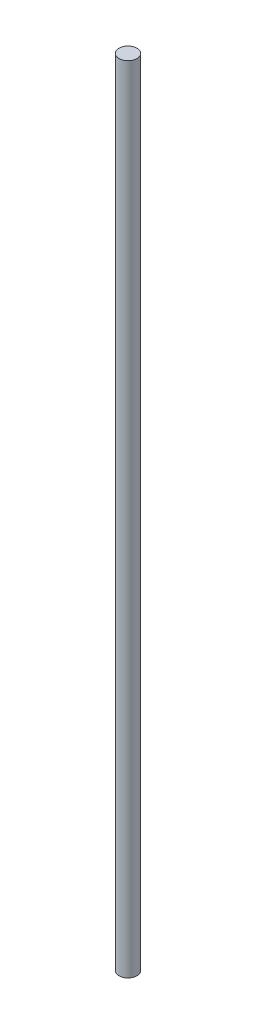
ISO-10303-21;
HEADER;
FILE_DESCRIPTION(('STEP AP214'),'2;1');
FILE_NAME('part.step','',(''),(''),'','','');
FILE_SCHEMA(('AUTOMOTIVE_DESIGN { 1 0 10303 214 1 1 1 1 }'));
ENDSEC;
DATA;
#1=APPLICATION_CONTEXT('core data for automotive mechanical design processes');
#2=APPLICATION_PROTOCOL_DEFINITION('international standard','automotive_design',2000,#1);
#3=PRODUCT_CONTEXT('',#1,'mechanical');
#4=PRODUCT('Part','Part','',(#3));
#5=PRODUCT_RELATED_PRODUCT_CATEGORY('part','',(#4));
#6=PRODUCT_DEFINITION_FORMATION('','',#4);
#7=PRODUCT_DEFINITION_CONTEXT('part definition',#1,'design');
#8=PRODUCT_DEFINITION('design','',#6,#7);
#9=PRODUCT_DEFINITION_SHAPE('','',#8);
#10=(LENGTH_UNIT() NAMED_UNIT(*) SI_UNIT(.MILLI.,.METRE.));
#11=(NAMED_UNIT(*) PLANE_ANGLE_UNIT() SI_UNIT($,.RADIAN.));
#12=(NAMED_UNIT(*) SI_UNIT($,.STERADIAN.) SOLID_ANGLE_UNIT());
#13=UNCERTAINTY_MEASURE_WITH_UNIT(LENGTH_MEASURE(1.E-05),#10,'distance_accuracy_value','');
#14=(GEOMETRIC_REPRESENTATION_CONTEXT(3) GLOBAL_UNCERTAINTY_ASSIGNED_CONTEXT((#13)) GLOBAL_UNIT_ASSIGNED_CONTEXT((#10,
#11,#12)) REPRESENTATION_CONTEXT('',''));
#15=CARTESIAN_POINT('',(0.,0.,0.));
#16=DIRECTION('',(0.,0.,1.));
#17=DIRECTION('',(1.,0.,0.));
#18=AXIS2_PLACEMENT_3D('',#15,#16,#17);
#19=CARTESIAN_POINT('',(0.,280.416,0.));
#20=DIRECTION('',(0.,-1.,0.));
#21=DIRECTION('',(0.,0.,-1.));
#22=AXIS2_PLACEMENT_3D('',#19,#20,#21);
#23=CYLINDRICAL_SURFACE('',#22,3.175);
#24=CARTESIAN_POINT('',(0.,280.416,0.));
#25=DIRECTION('',(0.,1.,0.));
#26=DIRECTION('',(0.,0.,1.));
#27=AXIS2_PLACEMENT_3D('',#24,#25,#26);
#28=CIRCLE('',#27,3.175);
#29=CARTESIAN_POINT('',(0.,280.416,3.175));
#30=VERTEX_POINT('',#29);
#31=EDGE_CURVE('E10',#30,#30,#28,.T.);
#32=ORIENTED_EDGE('',*,*,#31,.F.);
#33=EDGE_LOOP('',(#32));
#34=FACE_BOUND('',#33,.T.);
#35=CARTESIAN_POINT('',(0.,0.,0.));
#36=DIRECTION('',(0.,1.,0.));
#37=DIRECTION('',(0.,0.,1.));
#38=AXIS2_PLACEMENT_3D('',#35,#36,#37);
#39=CIRCLE('',#38,3.175);
#40=CARTESIAN_POINT('',(0.,0.,3.175));
#41=VERTEX_POINT('',#40);
#42=EDGE_CURVE('E46',#41,#41,#39,.T.);
#43=ORIENTED_EDGE('',*,*,#42,.T.);
#44=EDGE_LOOP('',(#43));
#45=FACE_BOUND('',#44,.T.);
#46=ADVANCED_FACE('F43',(#34,#45),#23,.T.);
#47=CARTESIAN_POINT('',(0.,280.416,0.));
#48=DIRECTION('',(0.,1.,0.));
#49=DIRECTION('',(0.,0.,1.));
#50=AXIS2_PLACEMENT_3D('',#47,#48,#49);
#51=PLANE('',#50);
#52=ORIENTED_EDGE('',*,*,#31,.T.);
#53=EDGE_LOOP('',(#52));
#54=FACE_BOUND('',#53,.T.);
#55=ADVANCED_FACE('F59',(#54),#51,.T.);
#56=CARTESIAN_POINT('',(0.,0.,0.));
#57=DIRECTION('',(0.,1.,0.));
#58=DIRECTION('',(0.,0.,1.));
#59=AXIS2_PLACEMENT_3D('',#56,#57,#58);
#60=PLANE('',#59);
#61=ORIENTED_EDGE('',*,*,#42,.F.);
#62=EDGE_LOOP('',(#61));
#63=FACE_BOUND('',#62,.T.);
#64=ADVANCED_FACE('F57',(#63),#60,.F.);
#65=CLOSED_SHELL('',(#46,#55,#64));
#66=MANIFOLD_SOLID_BREP('B2',#65);
#67=ADVANCED_BREP_SHAPE_REPRESENTATION('',(#18,#66),#14);
#68=SHAPE_DEFINITION_REPRESENTATION(#9,#67);
ENDSEC;
END-ISO-10303-21;
